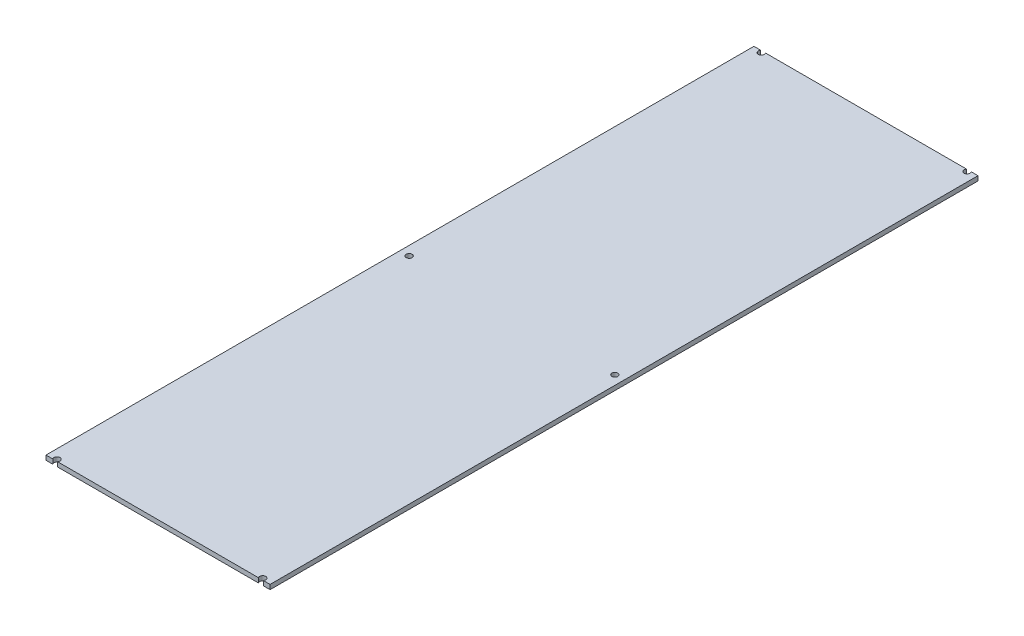
ISO-10303-21;
HEADER;
FILE_DESCRIPTION(('STEP AP214'),'2;1');
FILE_NAME('part.step','',(''),(''),'','','');
FILE_SCHEMA(('AUTOMOTIVE_DESIGN { 1 0 10303 214 1 1 1 1 }'));
ENDSEC;
DATA;
#1=APPLICATION_CONTEXT('core data for automotive mechanical design processes');
#2=APPLICATION_PROTOCOL_DEFINITION('international standard','automotive_design',2000,#1);
#3=PRODUCT_CONTEXT('',#1,'mechanical');
#4=PRODUCT('Part','Part','',(#3));
#5=PRODUCT_RELATED_PRODUCT_CATEGORY('part','',(#4));
#6=PRODUCT_DEFINITION_FORMATION('','',#4);
#7=PRODUCT_DEFINITION_CONTEXT('part definition',#1,'design');
#8=PRODUCT_DEFINITION('design','',#6,#7);
#9=PRODUCT_DEFINITION_SHAPE('','',#8);
#10=(LENGTH_UNIT() NAMED_UNIT(*) SI_UNIT(.MILLI.,.METRE.));
#11=(NAMED_UNIT(*) PLANE_ANGLE_UNIT() SI_UNIT($,.RADIAN.));
#12=(NAMED_UNIT(*) SI_UNIT($,.STERADIAN.) SOLID_ANGLE_UNIT());
#13=UNCERTAINTY_MEASURE_WITH_UNIT(LENGTH_MEASURE(1.E-05),#10,'distance_accuracy_value','');
#14=(GEOMETRIC_REPRESENTATION_CONTEXT(3) GLOBAL_UNCERTAINTY_ASSIGNED_CONTEXT((#13)) GLOBAL_UNIT_ASSIGNED_CONTEXT((#10,
#11,#12)) REPRESENTATION_CONTEXT('',''));
#15=CARTESIAN_POINT('',(0.,0.,0.));
#16=DIRECTION('',(0.,0.,1.));
#17=DIRECTION('',(1.,0.,0.));
#18=AXIS2_PLACEMENT_3D('',#15,#16,#17);
#19=CARTESIAN_POINT('',(-1.11022302462516E-13,5.,0.));
#20=DIRECTION('',(0.,1.,0.));
#21=DIRECTION('',(-1.,0.,0.));
#22=AXIS2_PLACEMENT_3D('',#19,#20,#21);
#23=PLANE('',#22);
#24=DIRECTION('',(0.,0.,1.));
#25=VECTOR('',#24,1.);
#26=CARTESIAN_POINT('',(-122.499999999998,5.00000000000028,-387.));
#27=LINE('',#26,#25);
#28=CARTESIAN_POINT('',(-122.499999999998,5.00000000000022,-387.));
#29=VERTEX_POINT('',#28);
#30=CARTESIAN_POINT('',(-122.499999999999,5.00000000000005,387.000000000003));
#31=VERTEX_POINT('',#30);
#32=EDGE_CURVE('E155',#29,#31,#27,.T.);
#33=ORIENTED_EDGE('',*,*,#32,.T.);
#34=DIRECTION('',(1.,0.,0.));
#35=VECTOR('',#34,1.);
#36=CARTESIAN_POINT('',(-122.5,4.99999999999993,387.000000000003));
#37=LINE('',#36,#35);
#38=CARTESIAN_POINT('',(-115.06173769149,5.,387.000000000003));
#39=VERTEX_POINT('',#38);
#40=EDGE_CURVE('E151',#31,#39,#37,.T.);
#41=ORIENTED_EDGE('',*,*,#40,.T.);
#42=CARTESIAN_POINT('',(-112.5,5.,385.000000000004));
#43=DIRECTION('',(0.,1.,0.));
#44=DIRECTION('',(-1.,0.,0.));
#45=AXIS2_PLACEMENT_3D('',#42,#43,#44);
#46=CIRCLE('',#45,3.25000000000003);
#47=CARTESIAN_POINT('',(-109.93826230851,4.99999999999998,387.000000000003));
#48=VERTEX_POINT('',#47);
#49=EDGE_CURVE('E147',#39,#48,#46,.F.);
#50=ORIENTED_EDGE('',*,*,#49,.T.);
#51=DIRECTION('',(1.,0.,0.));
#52=VECTOR('',#51,1.);
#53=CARTESIAN_POINT('',(-122.5,4.99999999999996,387.000000000003));
#54=LINE('',#53,#52);
#55=CARTESIAN_POINT('',(109.938262308508,5.0000000000003,387.000000000003));
#56=VERTEX_POINT('',#55);
#57=EDGE_CURVE('E143',#48,#56,#54,.T.);
#58=ORIENTED_EDGE('',*,*,#57,.T.);
#59=CARTESIAN_POINT('',(112.499999999999,5.00000000000156,385.000000000004));
#60=DIRECTION('',(0.,1.,0.));
#61=DIRECTION('',(-1.,0.,0.));
#62=AXIS2_PLACEMENT_3D('',#59,#60,#61);
#63=CIRCLE('',#62,3.25000000000003);
#64=CARTESIAN_POINT('',(115.061737691489,5.0000000000011,387.000000000003));
#65=VERTEX_POINT('',#64);
#66=EDGE_CURVE('E134',#56,#65,#63,.F.);
#67=ORIENTED_EDGE('',*,*,#66,.T.);
#68=DIRECTION('',(1.,0.,0.));
#69=VECTOR('',#68,1.);
#70=CARTESIAN_POINT('',(-122.5,5.00000000000064,387.000000000003));
#71=LINE('',#70,#69);
#72=CARTESIAN_POINT('',(122.499999999998,5.00000000000003,387.000000000004));
#73=VERTEX_POINT('',#72);
#74=EDGE_CURVE('E132',#65,#73,#71,.T.);
#75=ORIENTED_EDGE('',*,*,#74,.T.);
#76=DIRECTION('',(0.,0.,1.));
#77=VECTOR('',#76,1.);
#78=CARTESIAN_POINT('',(122.499999999998,4.99999999999973,-387.));
#79=LINE('',#78,#77);
#80=CARTESIAN_POINT('',(122.499999999999,4.99999999999996,-387.));
#81=VERTEX_POINT('',#80);
#82=EDGE_CURVE('E98',#73,#81,#79,.F.);
#83=ORIENTED_EDGE('',*,*,#82,.T.);
#84=DIRECTION('',(1.,0.,0.));
#85=VECTOR('',#84,1.);
#86=CARTESIAN_POINT('',(-122.499999999998,5.00000000000008,-387.));
#87=LINE('',#86,#85);
#88=CARTESIAN_POINT('',(115.06173769149,5.00000000000006,-387.));
#89=VERTEX_POINT('',#88);
#90=EDGE_CURVE('E182',#81,#89,#87,.F.);
#91=ORIENTED_EDGE('',*,*,#90,.T.);
#92=CARTESIAN_POINT('',(112.5,5.00000000000001,-385.000000000001));
#93=DIRECTION('',(0.,1.,0.));
#94=DIRECTION('',(-1.,0.,0.));
#95=AXIS2_PLACEMENT_3D('',#92,#93,#94);
#96=CIRCLE('',#95,3.25000000000003);
#97=CARTESIAN_POINT('',(109.93826230851,5.00000000000003,-387.));
#98=VERTEX_POINT('',#97);
#99=EDGE_CURVE('E20',#89,#98,#96,.F.);
#100=ORIENTED_EDGE('',*,*,#99,.T.);
#101=DIRECTION('',(1.,0.,0.));
#102=VECTOR('',#101,1.);
#103=CARTESIAN_POINT('',(-122.499999999998,5.00000000000005,-387.));
#104=LINE('',#103,#102);
#105=CARTESIAN_POINT('',(-109.938262308507,5.00000000000045,-387.));
#106=VERTEX_POINT('',#105);
#107=EDGE_CURVE('E85',#98,#106,#104,.F.);
#108=ORIENTED_EDGE('',*,*,#107,.T.);
#109=CARTESIAN_POINT('',(-112.499999999997,5.00000000000145,-385.000000000001));
#110=DIRECTION('',(0.,1.,0.));
#111=DIRECTION('',(-1.,0.,0.));
#112=AXIS2_PLACEMENT_3D('',#109,#110,#111);
#113=CIRCLE('',#112,3.25000000000003);
#114=CARTESIAN_POINT('',(-115.061737691487,5.00000000000077,-387.));
#115=VERTEX_POINT('',#114);
#116=EDGE_CURVE('E176',#106,#115,#113,.F.);
#117=ORIENTED_EDGE('',*,*,#116,.T.);
#118=DIRECTION('',(1.,0.,0.));
#119=VECTOR('',#118,1.);
#120=CARTESIAN_POINT('',(-122.499999999998,5.00000000000009,-387.));
#121=LINE('',#120,#119);
#122=EDGE_CURVE('E173',#115,#29,#121,.F.);
#123=ORIENTED_EDGE('',*,*,#122,.T.);
#124=EDGE_LOOP('',(#33,#41,#50,#58,#67,#75,#83,#91,#100,#108,#117,#123));
#125=FACE_BOUND('',#124,.T.);
#126=CARTESIAN_POINT('',(112.5,5.,0.));
#127=DIRECTION('',(0.,1.,0.));
#128=DIRECTION('',(-1.,0.,0.));
#129=AXIS2_PLACEMENT_3D('',#126,#127,#128);
#130=CIRCLE('',#129,3.25000000000003);
#131=CARTESIAN_POINT('',(109.25,5.00000000000001,0.));
#132=VERTEX_POINT('',#131);
#133=EDGE_CURVE('E129',#132,#132,#130,.F.);
#134=ORIENTED_EDGE('',*,*,#133,.T.);
#135=EDGE_LOOP('',(#134));
#136=FACE_BOUND('',#135,.T.);
#137=CARTESIAN_POINT('',(-112.5,4.99999999999845,0.));
#138=DIRECTION('',(0.,1.,0.));
#139=DIRECTION('',(-1.,0.,0.));
#140=AXIS2_PLACEMENT_3D('',#137,#138,#139);
#141=CIRCLE('',#140,3.25000000000002);
#142=CARTESIAN_POINT('',(-115.75,4.99999999999845,0.));
#143=VERTEX_POINT('',#142);
#144=EDGE_CURVE('E133',#143,#143,#141,.F.);
#145=ORIENTED_EDGE('',*,*,#144,.T.);
#146=EDGE_LOOP('',(#145));
#147=FACE_BOUND('',#146,.T.);
#148=ADVANCED_FACE('F17',(#125,#136,#147),#23,.T.);
#149=CARTESIAN_POINT('',(-122.5,5.,387.000000000003));
#150=DIRECTION('',(0.,0.,-1.));
#151=DIRECTION('',(0.,1.,0.));
#152=AXIS2_PLACEMENT_3D('',#149,#150,#151);
#153=PLANE('',#152);
#154=DIRECTION('',(-1.,0.,0.));
#155=VECTOR('',#154,1.);
#156=CARTESIAN_POINT('',(0.,-1.7683183359304E-13,387.000000000003));
#157=LINE('',#156,#155);
#158=CARTESIAN_POINT('',(115.061737691489,-1.36028047906823E-13,387.000000000003));
#159=VERTEX_POINT('',#158);
#160=CARTESIAN_POINT('',(122.499999999998,-2.7933230479435E-13,387.000000000003));
#161=VERTEX_POINT('',#160);
#162=EDGE_CURVE('E124',#159,#161,#157,.F.);
#163=ORIENTED_EDGE('',*,*,#162,.T.);
#164=DIRECTION('',(0.,-1.,0.));
#165=VECTOR('',#164,1.);
#166=CARTESIAN_POINT('',(122.499999999998,4.99999999999989,387.000000000004));
#167=LINE('',#166,#165);
#168=EDGE_CURVE('E108',#161,#73,#167,.F.);
#169=ORIENTED_EDGE('',*,*,#168,.T.);
#170=ORIENTED_EDGE('',*,*,#74,.F.);
#171=DIRECTION('',(0.,1.,0.));
#172=VECTOR('',#171,1.);
#173=CARTESIAN_POINT('',(115.061737691489,1.44205984963401E-12,387.000000000003));
#174=LINE('',#173,#172);
#175=EDGE_CURVE('E116',#65,#159,#174,.F.);
#176=ORIENTED_EDGE('',*,*,#175,.T.);
#177=EDGE_LOOP('',(#163,#169,#170,#176));
#178=FACE_BOUND('',#177,.T.);
#179=ADVANCED_FACE('F131',(#178),#153,.F.);
#180=CARTESIAN_POINT('',(122.499999999998,4.99999999999989,-387.));
#181=DIRECTION('',(-1.,0.,0.));
#182=DIRECTION('',(0.,-1.,0.));
#183=AXIS2_PLACEMENT_3D('',#180,#181,#182);
#184=PLANE('',#183);
#185=ORIENTED_EDGE('',*,*,#82,.F.);
#186=ORIENTED_EDGE('',*,*,#168,.F.);
#187=DIRECTION('',(0.,0.,1.));
#188=VECTOR('',#187,1.);
#189=CARTESIAN_POINT('',(122.499999999998,-1.02521383782351E-13,0.));
#190=LINE('',#189,#188);
#191=CARTESIAN_POINT('',(122.499999999999,0.,-387.));
#192=VERTEX_POINT('',#191);
#193=EDGE_CURVE('E127',#161,#192,#190,.F.);
#194=ORIENTED_EDGE('',*,*,#193,.T.);
#195=DIRECTION('',(0.,-1.,0.));
#196=VECTOR('',#195,1.);
#197=CARTESIAN_POINT('',(122.5,5.,-387.));
#198=LINE('',#197,#196);
#199=EDGE_CURVE('E183',#192,#81,#198,.F.);
#200=ORIENTED_EDGE('',*,*,#199,.T.);
#201=EDGE_LOOP('',(#185,#186,#194,#200));
#202=FACE_BOUND('',#201,.T.);
#203=ADVANCED_FACE('F259',(#202),#184,.F.);
#204=CARTESIAN_POINT('',(-122.499999999998,5.,-387.));
#205=DIRECTION('',(0.,0.,1.));
#206=DIRECTION('',(0.,-1.,0.));
#207=AXIS2_PLACEMENT_3D('',#204,#205,#206);
#208=PLANE('',#207);
#209=ORIENTED_EDGE('',*,*,#90,.F.);
#210=ORIENTED_EDGE('',*,*,#199,.F.);
#211=DIRECTION('',(-1.,0.,0.));
#212=VECTOR('',#211,1.);
#213=CARTESIAN_POINT('',(0.,1.76831833593039E-13,-387.));
#214=LINE('',#213,#212);
#215=CARTESIAN_POINT('',(115.06173769149,0.,-387.));
#216=VERTEX_POINT('',#215);
#217=EDGE_CURVE('E189',#192,#216,#214,.T.);
#218=ORIENTED_EDGE('',*,*,#217,.T.);
#219=DIRECTION('',(0.,1.,0.));
#220=VECTOR('',#219,1.);
#221=CARTESIAN_POINT('',(115.06173769149,0.,-387.));
#222=LINE('',#221,#220);
#223=EDGE_CURVE('E179',#216,#89,#222,.T.);
#224=ORIENTED_EDGE('',*,*,#223,.T.);
#225=EDGE_LOOP('',(#209,#210,#218,#224));
#226=FACE_BOUND('',#225,.T.);
#227=ADVANCED_FACE('F257',(#226),#208,.F.);
#228=CARTESIAN_POINT('',(112.5,0.,-385.000000000001));
#229=DIRECTION('',(0.,1.,0.));
#230=DIRECTION('',(-1.,0.,0.));
#231=AXIS2_PLACEMENT_3D('',#228,#229,#230);
#232=CYLINDRICAL_SURFACE('',#231,3.25000000000003);
#233=CARTESIAN_POINT('',(112.5,0.,-385.000000000001));
#234=DIRECTION('',(0.,1.,0.));
#235=DIRECTION('',(-1.,0.,0.));
#236=AXIS2_PLACEMENT_3D('',#233,#234,#235);
#237=CIRCLE('',#236,3.25000000000003);
#238=CARTESIAN_POINT('',(109.93826230851,4.02742731174979E-13,-387.));
#239=VERTEX_POINT('',#238);
#240=EDGE_CURVE('E226',#216,#239,#237,.F.);
#241=ORIENTED_EDGE('',*,*,#240,.T.);
#242=DIRECTION('',(0.,-1.,0.));
#243=VECTOR('',#242,1.);
#244=CARTESIAN_POINT('',(109.93826230851,5.,-387.));
#245=LINE('',#244,#243);
#246=EDGE_CURVE('E177',#239,#98,#245,.F.);
#247=ORIENTED_EDGE('',*,*,#246,.T.);
#248=ORIENTED_EDGE('',*,*,#99,.F.);
#249=ORIENTED_EDGE('',*,*,#223,.F.);
#250=EDGE_LOOP('',(#241,#247,#248,#249));
#251=FACE_BOUND('',#250,.T.);
#252=ADVANCED_FACE('F267',(#251),#232,.F.);
#253=CARTESIAN_POINT('',(-122.499999999998,5.,-387.));
#254=DIRECTION('',(0.,0.,1.));
#255=DIRECTION('',(0.,-1.,0.));
#256=AXIS2_PLACEMENT_3D('',#253,#254,#255);
#257=PLANE('',#256);
#258=DIRECTION('',(-1.,0.,0.));
#259=VECTOR('',#258,1.);
#260=CARTESIAN_POINT('',(0.,1.76831833593039E-13,-387.));
#261=LINE('',#260,#259);
#262=CARTESIAN_POINT('',(-109.938262308507,1.32276149435121E-13,-387.));
#263=VERTEX_POINT('',#262);
#264=EDGE_CURVE('E225',#239,#263,#261,.T.);
#265=ORIENTED_EDGE('',*,*,#264,.T.);
#266=DIRECTION('',(0.,1.,0.));
#267=VECTOR('',#266,1.);
#268=CARTESIAN_POINT('',(-109.938262308507,0.,-387.));
#269=LINE('',#268,#267);
#270=EDGE_CURVE('E174',#263,#106,#269,.T.);
#271=ORIENTED_EDGE('',*,*,#270,.T.);
#272=ORIENTED_EDGE('',*,*,#107,.F.);
#273=ORIENTED_EDGE('',*,*,#246,.F.);
#274=EDGE_LOOP('',(#265,#271,#272,#273));
#275=FACE_BOUND('',#274,.T.);
#276=ADVANCED_FACE('F307',(#275),#257,.F.);
#277=CARTESIAN_POINT('',(-112.499999999997,0.,-385.000000000001));
#278=DIRECTION('',(0.,1.,0.));
#279=DIRECTION('',(-1.,0.,0.));
#280=AXIS2_PLACEMENT_3D('',#277,#278,#279);
#281=CYLINDRICAL_SURFACE('',#280,3.25000000000003);
#282=CARTESIAN_POINT('',(-112.499999999997,0.,-385.000000000001));
#283=DIRECTION('',(0.,1.,0.));
#284=DIRECTION('',(-1.,0.,0.));
#285=AXIS2_PLACEMENT_3D('',#282,#283,#284);
#286=CIRCLE('',#285,3.25000000000003);
#287=CARTESIAN_POINT('',(-115.061737691487,1.36050768072019E-13,-387.));
#288=VERTEX_POINT('',#287);
#289=EDGE_CURVE('E223',#263,#288,#286,.F.);
#290=ORIENTED_EDGE('',*,*,#289,.T.);
#291=DIRECTION('',(0.,-1.,0.));
#292=VECTOR('',#291,1.);
#293=CARTESIAN_POINT('',(-115.061737691487,5.,-387.));
#294=LINE('',#293,#292);
#295=EDGE_CURVE('E168',#288,#115,#294,.F.);
#296=ORIENTED_EDGE('',*,*,#295,.T.);
#297=ORIENTED_EDGE('',*,*,#116,.F.);
#298=ORIENTED_EDGE('',*,*,#270,.F.);
#299=EDGE_LOOP('',(#290,#296,#297,#298));
#300=FACE_BOUND('',#299,.T.);
#301=ADVANCED_FACE('F235',(#300),#281,.F.);
#302=CARTESIAN_POINT('',(-122.499999999998,5.,-387.));
#303=DIRECTION('',(0.,0.,1.));
#304=DIRECTION('',(0.,-1.,0.));
#305=AXIS2_PLACEMENT_3D('',#302,#303,#304);
#306=PLANE('',#305);
#307=DIRECTION('',(-1.,0.,0.));
#308=VECTOR('',#307,1.);
#309=CARTESIAN_POINT('',(0.,1.76831833593039E-13,-387.));
#310=LINE('',#309,#308);
#311=CARTESIAN_POINT('',(-122.499999999998,2.79332304794349E-13,-387.));
#312=VERTEX_POINT('',#311);
#313=EDGE_CURVE('E162',#288,#312,#310,.T.);
#314=ORIENTED_EDGE('',*,*,#313,.T.);
#315=DIRECTION('',(0.,1.,0.));
#316=VECTOR('',#315,1.);
#317=CARTESIAN_POINT('',(-122.499999999998,5.,-387.));
#318=LINE('',#317,#316);
#319=EDGE_CURVE('E165',#312,#29,#318,.T.);
#320=ORIENTED_EDGE('',*,*,#319,.T.);
#321=ORIENTED_EDGE('',*,*,#122,.F.);
#322=ORIENTED_EDGE('',*,*,#295,.F.);
#323=EDGE_LOOP('',(#314,#320,#321,#322));
#324=FACE_BOUND('',#323,.T.);
#325=ADVANCED_FACE('F240',(#324),#306,.F.);
#326=CARTESIAN_POINT('',(-122.499999999998,5.,-387.));
#327=DIRECTION('',(1.,0.,0.));
#328=DIRECTION('',(0.,1.,0.));
#329=AXIS2_PLACEMENT_3D('',#326,#327,#328);
#330=PLANE('',#329);
#331=ORIENTED_EDGE('',*,*,#32,.F.);
#332=ORIENTED_EDGE('',*,*,#319,.F.);
#333=DIRECTION('',(0.,0.,1.));
#334=VECTOR('',#333,1.);
#335=CARTESIAN_POINT('',(-122.499999999998,1.02521383782352E-13,0.));
#336=LINE('',#335,#334);
#337=CARTESIAN_POINT('',(-122.499999999999,0.,387.000000000003));
#338=VERTEX_POINT('',#337);
#339=EDGE_CURVE('E158',#312,#338,#336,.T.);
#340=ORIENTED_EDGE('',*,*,#339,.T.);
#341=DIRECTION('',(0.,1.,0.));
#342=VECTOR('',#341,1.);
#343=CARTESIAN_POINT('',(-122.499999999999,5.,387.000000000003));
#344=LINE('',#343,#342);
#345=EDGE_CURVE('E152',#338,#31,#344,.T.);
#346=ORIENTED_EDGE('',*,*,#345,.T.);
#347=EDGE_LOOP('',(#331,#332,#340,#346));
#348=FACE_BOUND('',#347,.T.);
#349=ADVANCED_FACE('F298',(#348),#330,.F.);
#350=CARTESIAN_POINT('',(-122.5,5.,387.000000000003));
#351=DIRECTION('',(0.,0.,-1.));
#352=DIRECTION('',(0.,1.,0.));
#353=AXIS2_PLACEMENT_3D('',#350,#351,#352);
#354=PLANE('',#353);
#355=ORIENTED_EDGE('',*,*,#40,.F.);
#356=ORIENTED_EDGE('',*,*,#345,.F.);
#357=DIRECTION('',(-1.,0.,0.));
#358=VECTOR('',#357,1.);
#359=CARTESIAN_POINT('',(0.,-1.7683183359304E-13,387.000000000003));
#360=LINE('',#359,#358);
#361=CARTESIAN_POINT('',(-115.06173769149,7.39032259031178E-13,387.000000000003));
#362=VERTEX_POINT('',#361);
#363=EDGE_CURVE('E161',#338,#362,#360,.F.);
#364=ORIENTED_EDGE('',*,*,#363,.T.);
#365=DIRECTION('',(0.,1.,0.));
#366=VECTOR('',#365,1.);
#367=CARTESIAN_POINT('',(-115.06173769149,0.,387.000000000004));
#368=LINE('',#367,#366);
#369=EDGE_CURVE('E148',#362,#39,#368,.T.);
#370=ORIENTED_EDGE('',*,*,#369,.T.);
#371=EDGE_LOOP('',(#355,#356,#364,#370));
#372=FACE_BOUND('',#371,.T.);
#373=ADVANCED_FACE('F294',(#372),#354,.F.);
#374=CARTESIAN_POINT('',(-112.5,0.,385.000000000004));
#375=DIRECTION('',(0.,1.,0.));
#376=DIRECTION('',(-1.,0.,0.));
#377=AXIS2_PLACEMENT_3D('',#374,#375,#376);
#378=CYLINDRICAL_SURFACE('',#377,3.25000000000003);
#379=CARTESIAN_POINT('',(-112.5,1.55554231685392E-12,385.000000000004));
#380=DIRECTION('',(0.,1.,0.));
#381=DIRECTION('',(-1.,0.,0.));
#382=AXIS2_PLACEMENT_3D('',#379,#380,#381);
#383=CIRCLE('',#382,3.25000000000003);
#384=CARTESIAN_POINT('',(-109.93826230851,7.35235869065806E-13,387.000000000003));
#385=VERTEX_POINT('',#384);
#386=EDGE_CURVE('E221',#362,#385,#383,.F.);
#387=ORIENTED_EDGE('',*,*,#386,.T.);
#388=DIRECTION('',(0.,1.,0.));
#389=VECTOR('',#388,1.);
#390=CARTESIAN_POINT('',(-109.93826230851,5.,387.000000000003));
#391=LINE('',#390,#389);
#392=EDGE_CURVE('E144',#385,#48,#391,.T.);
#393=ORIENTED_EDGE('',*,*,#392,.T.);
#394=ORIENTED_EDGE('',*,*,#49,.F.);
#395=ORIENTED_EDGE('',*,*,#369,.F.);
#396=EDGE_LOOP('',(#387,#393,#394,#395));
#397=FACE_BOUND('',#396,.T.);
#398=ADVANCED_FACE('F290',(#397),#378,.F.);
#399=CARTESIAN_POINT('',(-122.5,5.,387.000000000003));
#400=DIRECTION('',(0.,0.,-1.));
#401=DIRECTION('',(0.,1.,0.));
#402=AXIS2_PLACEMENT_3D('',#399,#400,#401);
#403=PLANE('',#402);
#404=ORIENTED_EDGE('',*,*,#57,.F.);
#405=ORIENTED_EDGE('',*,*,#392,.F.);
#406=DIRECTION('',(-1.,0.,0.));
#407=VECTOR('',#406,1.);
#408=CARTESIAN_POINT('',(0.,-1.7683183359304E-13,387.000000000003));
#409=LINE('',#408,#407);
#410=CARTESIAN_POINT('',(109.938262308508,-1.32276149435123E-13,387.000000000003));
#411=VERTEX_POINT('',#410);
#412=EDGE_CURVE('E121',#385,#411,#409,.F.);
#413=ORIENTED_EDGE('',*,*,#412,.T.);
#414=DIRECTION('',(0.,1.,0.));
#415=VECTOR('',#414,1.);
#416=CARTESIAN_POINT('',(109.938262308508,1.44634773360166E-12,387.000000000003));
#417=LINE('',#416,#415);
#418=EDGE_CURVE('E35',#411,#56,#417,.T.);
#419=ORIENTED_EDGE('',*,*,#418,.T.);
#420=EDGE_LOOP('',(#404,#405,#413,#419));
#421=FACE_BOUND('',#420,.T.);
#422=ADVANCED_FACE('F287',(#421),#403,.F.);
#423=CARTESIAN_POINT('',(112.499999999999,1.4432899320127E-12,385.000000000004));
#424=DIRECTION('',(0.,1.,0.));
#425=DIRECTION('',(-1.,0.,0.));
#426=AXIS2_PLACEMENT_3D('',#423,#424,#425);
#427=CYLINDRICAL_SURFACE('',#426,3.25000000000003);
#428=CARTESIAN_POINT('',(112.499999999999,0.,385.000000000004));
#429=DIRECTION('',(0.,1.,0.));
#430=DIRECTION('',(-1.,0.,0.));
#431=AXIS2_PLACEMENT_3D('',#428,#429,#430);
#432=CIRCLE('',#431,3.25000000000003);
#433=EDGE_CURVE('E112',#411,#159,#432,.F.);
#434=ORIENTED_EDGE('',*,*,#433,.T.);
#435=ORIENTED_EDGE('',*,*,#175,.F.);
#436=ORIENTED_EDGE('',*,*,#66,.F.);
#437=ORIENTED_EDGE('',*,*,#418,.F.);
#438=EDGE_LOOP('',(#434,#435,#436,#437));
#439=FACE_BOUND('',#438,.T.);
#440=ADVANCED_FACE('F114',(#439),#427,.F.);
#441=CARTESIAN_POINT('',(-112.5,-1.55431223447522E-12,0.));
#442=DIRECTION('',(0.,1.,0.));
#443=DIRECTION('',(-1.,0.,0.));
#444=AXIS2_PLACEMENT_3D('',#441,#442,#443);
#445=CYLINDRICAL_SURFACE('',#444,3.25000000000002);
#446=CARTESIAN_POINT('',(-112.5,-1.55431223447522E-12,0.));
#447=DIRECTION('',(0.,1.,0.));
#448=DIRECTION('',(-1.,0.,0.));
#449=AXIS2_PLACEMENT_3D('',#446,#447,#448);
#450=CIRCLE('',#449,3.25000000000002);
#451=CARTESIAN_POINT('',(-115.75,-1.55159227939528E-12,0.));
#452=VERTEX_POINT('',#451);
#453=EDGE_CURVE('E26',#452,#452,#450,.F.);
#454=ORIENTED_EDGE('',*,*,#453,.T.);
#455=EDGE_LOOP('',(#454));
#456=FACE_BOUND('',#455,.T.);
#457=ORIENTED_EDGE('',*,*,#144,.F.);
#458=EDGE_LOOP('',(#457));
#459=FACE_BOUND('',#458,.T.);
#460=ADVANCED_FACE('F276',(#456,#459),#445,.F.);
#461=CARTESIAN_POINT('',(112.5,0.,0.));
#462=DIRECTION('',(0.,1.,0.));
#463=DIRECTION('',(-1.,0.,0.));
#464=AXIS2_PLACEMENT_3D('',#461,#462,#463);
#465=CYLINDRICAL_SURFACE('',#464,3.25000000000003);
#466=CARTESIAN_POINT('',(112.5,0.,0.));
#467=DIRECTION('',(0.,1.,0.));
#468=DIRECTION('',(-1.,0.,0.));
#469=AXIS2_PLACEMENT_3D('',#466,#467,#468);
#470=CIRCLE('',#469,3.25000000000003);
#471=CARTESIAN_POINT('',(109.25,0.,0.));
#472=VERTEX_POINT('',#471);
#473=EDGE_CURVE('E11',#472,#472,#470,.F.);
#474=ORIENTED_EDGE('',*,*,#473,.T.);
#475=EDGE_LOOP('',(#474));
#476=FACE_BOUND('',#475,.T.);
#477=ORIENTED_EDGE('',*,*,#133,.F.);
#478=EDGE_LOOP('',(#477));
#479=FACE_BOUND('',#478,.T.);
#480=ADVANCED_FACE('F270',(#476,#479),#465,.F.);
#481=CARTESIAN_POINT('',(0.,0.,0.));
#482=DIRECTION('',(0.,1.,0.));
#483=DIRECTION('',(-1.,0.,0.));
#484=AXIS2_PLACEMENT_3D('',#481,#482,#483);
#485=PLANE('',#484);
#486=ORIENTED_EDGE('',*,*,#473,.F.);
#487=EDGE_LOOP('',(#486));
#488=FACE_BOUND('',#487,.T.);
#489=ORIENTED_EDGE('',*,*,#453,.F.);
#490=EDGE_LOOP('',(#489));
#491=FACE_BOUND('',#490,.T.);
#492=ORIENTED_EDGE('',*,*,#162,.F.);
#493=ORIENTED_EDGE('',*,*,#433,.F.);
#494=ORIENTED_EDGE('',*,*,#412,.F.);
#495=ORIENTED_EDGE('',*,*,#386,.F.);
#496=ORIENTED_EDGE('',*,*,#363,.F.);
#497=ORIENTED_EDGE('',*,*,#339,.F.);
#498=ORIENTED_EDGE('',*,*,#313,.F.);
#499=ORIENTED_EDGE('',*,*,#289,.F.);
#500=ORIENTED_EDGE('',*,*,#264,.F.);
#501=ORIENTED_EDGE('',*,*,#240,.F.);
#502=ORIENTED_EDGE('',*,*,#217,.F.);
#503=ORIENTED_EDGE('',*,*,#193,.F.);
#504=EDGE_LOOP('',(#492,#493,#494,#495,#496,#497,#498,#499,#500,#501,#502,#503));
#505=FACE_BOUND('',#504,.T.);
#506=ADVANCED_FACE('F125',(#488,#491,#505),#485,.F.);
#507=CLOSED_SHELL('',(#148,#179,#203,#227,#252,#276,#301,#325,#349,#373,#398,#422,#440,#460,
#480,#506));
#508=MANIFOLD_SOLID_BREP('B1',#507);
#509=ADVANCED_BREP_SHAPE_REPRESENTATION('',(#18,#508),#14);
#510=SHAPE_DEFINITION_REPRESENTATION(#9,#509);
ENDSEC;
END-ISO-10303-21;
